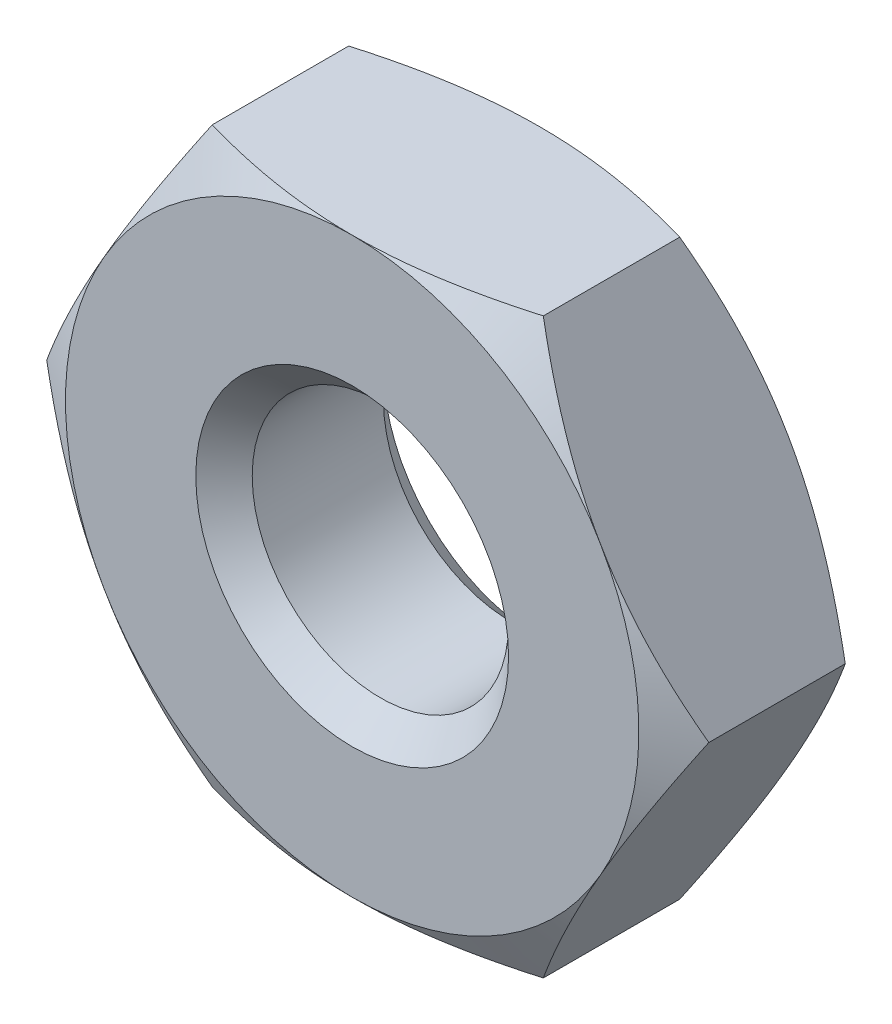
ISO-10303-21;
HEADER;
FILE_DESCRIPTION(('STEP AP214'),'2;1');
FILE_NAME('part.step','',(''),(''),'','','');
FILE_SCHEMA(('AUTOMOTIVE_DESIGN { 1 0 10303 214 1 1 1 1 }'));
ENDSEC;
DATA;
#1=APPLICATION_CONTEXT('core data for automotive mechanical design processes');
#2=APPLICATION_PROTOCOL_DEFINITION('international standard','automotive_design',2000,#1);
#3=PRODUCT_CONTEXT('',#1,'mechanical');
#4=PRODUCT('Part','Part','',(#3));
#5=PRODUCT_RELATED_PRODUCT_CATEGORY('part','',(#4));
#6=PRODUCT_DEFINITION_FORMATION('','',#4);
#7=PRODUCT_DEFINITION_CONTEXT('part definition',#1,'design');
#8=PRODUCT_DEFINITION('design','',#6,#7);
#9=PRODUCT_DEFINITION_SHAPE('','',#8);
#10=(LENGTH_UNIT() NAMED_UNIT(*) SI_UNIT(.MILLI.,.METRE.));
#11=(NAMED_UNIT(*) PLANE_ANGLE_UNIT() SI_UNIT($,.RADIAN.));
#12=(NAMED_UNIT(*) SI_UNIT($,.STERADIAN.) SOLID_ANGLE_UNIT());
#13=UNCERTAINTY_MEASURE_WITH_UNIT(LENGTH_MEASURE(1.E-05),#10,'distance_accuracy_value','');
#14=(GEOMETRIC_REPRESENTATION_CONTEXT(3) GLOBAL_UNCERTAINTY_ASSIGNED_CONTEXT((#13)) GLOBAL_UNIT_ASSIGNED_CONTEXT((#10,
#11,#12)) REPRESENTATION_CONTEXT('',''));
#15=CARTESIAN_POINT('',(0.,0.,0.));
#16=DIRECTION('',(0.,0.,1.));
#17=DIRECTION('',(1.,0.,0.));
#18=AXIS2_PLACEMENT_3D('',#15,#16,#17);
#19=CARTESIAN_POINT('',(2.38156986040721,1.375,-1.));
#20=DIRECTION('',(0.866025403784439,0.5,0.));
#21=DIRECTION('',(-0.5,0.866025403784439,0.));
#22=AXIS2_PLACEMENT_3D('',#19,#20,#21);
#23=PLANE('',#22);
#24=CARTESIAN_POINT('',(1.58689004084149,2.75142582323749,0.246095552242078));
#25=CARTESIAN_POINT('',(2.01280892325374,2.01371267899652,0.));
#26=CARTESIAN_POINT('',(2.38156986040721,1.375,0.));
#27=CARTESIAN_POINT('',(2.75033079756067,0.736287321003483,0.));
#28=CARTESIAN_POINT('',(3.17624967997292,-0.00142582323749121,0.246095552242078));
#29=(BOUNDED_CURVE() B_SPLINE_CURVE(2,(#24,#25,#26,#27,#28),.UNSPECIFIED.,.F.,
.F.) B_SPLINE_CURVE_WITH_KNOTS((3,2,3),(0.,1.6124120093164,3.22482401863281),
.UNSPECIFIED.) CURVE() GEOMETRIC_REPRESENTATION_ITEM() RATIONAL_B_SPLINE_CURVE((1.,
1.03802697460133,1.,1.03802697460133,1.)) REPRESENTATION_ITEM(''));
#30=CARTESIAN_POINT('',(1.58771324027147,2.75,0.245620093061862));
#31=VERTEX_POINT('',#30);
#32=CARTESIAN_POINT('',(2.38156986040721,1.375,0.));
#33=VERTEX_POINT('',#32);
#34=EDGE_CURVE('E229',#31,#33,#29,.T.);
#35=ORIENTED_EDGE('',*,*,#34,.F.);
#36=DIRECTION('',(0.,0.,1.));
#37=VECTOR('',#36,1.);
#38=CARTESIAN_POINT('',(1.58771324027147,2.75,-1.));
#39=LINE('',#38,#37);
#40=CARTESIAN_POINT('',(1.58771324027147,2.75,1.55437990693814));
#41=VERTEX_POINT('',#40);
#42=EDGE_CURVE('E11',#31,#41,#39,.T.);
#43=ORIENTED_EDGE('',*,*,#42,.T.);
#44=CARTESIAN_POINT('',(3.17624967997292,-0.00142582323749113,1.55390444775792));
#45=CARTESIAN_POINT('',(2.75033079756067,0.736287321003483,1.8));
#46=CARTESIAN_POINT('',(2.38156986040721,1.375,1.8));
#47=CARTESIAN_POINT('',(2.01280892325374,2.01371267899652,1.8));
#48=CARTESIAN_POINT('',(1.58689004084149,2.75142582323749,1.55390444775792));
#49=(BOUNDED_CURVE() B_SPLINE_CURVE(2,(#44,#45,#46,#47,#48),.UNSPECIFIED.,.F.,
.F.) B_SPLINE_CURVE_WITH_KNOTS((3,2,3),(0.,1.6124120093164,3.22482401863281),
.UNSPECIFIED.) CURVE() GEOMETRIC_REPRESENTATION_ITEM() RATIONAL_B_SPLINE_CURVE((1.,
1.03802697460133,1.,1.03802697460132,1.)) REPRESENTATION_ITEM(''));
#50=CARTESIAN_POINT('',(2.38156986040721,1.375,1.8));
#51=VERTEX_POINT('',#50);
#52=EDGE_CURVE('E221',#51,#41,#49,.T.);
#53=ORIENTED_EDGE('',*,*,#52,.F.);
#54=CARTESIAN_POINT('',(3.17624967997292,-0.00142582323749113,1.55390444775792));
#55=CARTESIAN_POINT('',(2.75033079756067,0.736287321003483,1.8));
#56=CARTESIAN_POINT('',(2.38156986040721,1.375,1.8));
#57=CARTESIAN_POINT('',(2.01280892325374,2.01371267899652,1.8));
#58=CARTESIAN_POINT('',(1.58689004084149,2.75142582323749,1.55390444775792));
#59=(BOUNDED_CURVE() B_SPLINE_CURVE(2,(#54,#55,#56,#57,#58),.UNSPECIFIED.,.F.,
.F.) B_SPLINE_CURVE_WITH_KNOTS((3,2,3),(0.,1.6124120093164,3.22482401863281),
.UNSPECIFIED.) CURVE() GEOMETRIC_REPRESENTATION_ITEM() RATIONAL_B_SPLINE_CURVE((1.,
1.03802697460133,1.,1.03802697460132,1.)) REPRESENTATION_ITEM(''));
#60=CARTESIAN_POINT('',(3.17542648054294,0.,1.55437990693814));
#61=VERTEX_POINT('',#60);
#62=EDGE_CURVE('E222',#61,#51,#59,.T.);
#63=ORIENTED_EDGE('',*,*,#62,.F.);
#64=DIRECTION('',(0.,0.,1.));
#65=VECTOR('',#64,1.);
#66=CARTESIAN_POINT('',(3.17542648054294,0.,-1.));
#67=LINE('',#66,#65);
#68=CARTESIAN_POINT('',(3.17542648054294,0.,0.245620093061863));
#69=VERTEX_POINT('',#68);
#70=EDGE_CURVE('E179',#69,#61,#67,.T.);
#71=ORIENTED_EDGE('',*,*,#70,.F.);
#72=CARTESIAN_POINT('',(1.58689004084149,2.75142582323749,0.246095552242078));
#73=CARTESIAN_POINT('',(2.01280892325374,2.01371267899652,0.));
#74=CARTESIAN_POINT('',(2.38156986040721,1.375,0.));
#75=CARTESIAN_POINT('',(2.75033079756067,0.736287321003483,0.));
#76=CARTESIAN_POINT('',(3.17624967997292,-0.00142582323749121,0.246095552242078));
#77=(BOUNDED_CURVE() B_SPLINE_CURVE(2,(#72,#73,#74,#75,#76),.UNSPECIFIED.,.F.,
.F.) B_SPLINE_CURVE_WITH_KNOTS((3,2,3),(0.,1.6124120093164,3.22482401863281),
.UNSPECIFIED.) CURVE() GEOMETRIC_REPRESENTATION_ITEM() RATIONAL_B_SPLINE_CURVE((1.,
1.03802697460133,1.,1.03802697460133,1.)) REPRESENTATION_ITEM(''));
#78=EDGE_CURVE('E209',#33,#69,#77,.T.);
#79=ORIENTED_EDGE('',*,*,#78,.F.);
#80=EDGE_LOOP('',(#35,#43,#53,#63,#71,#79));
#81=FACE_BOUND('',#80,.T.);
#82=ADVANCED_FACE('F16',(#81),#23,.T.);
#83=CARTESIAN_POINT('',(0.,2.75,-1.));
#84=DIRECTION('',(0.,1.,0.));
#85=DIRECTION('',(-1.,0.,0.));
#86=AXIS2_PLACEMENT_3D('',#83,#84,#85);
#87=PLANE('',#86);
#88=CARTESIAN_POINT('',(-1.58935963913144,2.75,0.246095552242078));
#89=CARTESIAN_POINT('',(-0.737521874306931,2.75,0.));
#90=CARTESIAN_POINT('',(0.,2.75,0.));
#91=CARTESIAN_POINT('',(0.737521874306931,2.75,0.));
#92=CARTESIAN_POINT('',(1.58935963913144,2.75,0.246095552242078));
#93=(BOUNDED_CURVE() B_SPLINE_CURVE(2,(#88,#89,#90,#91,#92),.UNSPECIFIED.,.F.,
.F.) B_SPLINE_CURVE_WITH_KNOTS((3,2,3),(0.,1.6124120093164,3.22482401863281),
.UNSPECIFIED.) CURVE() GEOMETRIC_REPRESENTATION_ITEM() RATIONAL_B_SPLINE_CURVE((1.,
1.03802697460135,1.,1.03802697460135,1.)) REPRESENTATION_ITEM(''));
#94=CARTESIAN_POINT('',(-1.58771324027147,2.75,0.245620093061861));
#95=VERTEX_POINT('',#94);
#96=CARTESIAN_POINT('',(0.,2.75,0.));
#97=VERTEX_POINT('',#96);
#98=EDGE_CURVE('E165',#95,#97,#93,.T.);
#99=ORIENTED_EDGE('',*,*,#98,.F.);
#100=DIRECTION('',(0.,0.,1.));
#101=VECTOR('',#100,1.);
#102=CARTESIAN_POINT('',(-1.58771324027147,2.75,-1.));
#103=LINE('',#102,#101);
#104=CARTESIAN_POINT('',(-1.58771324027147,2.75,1.55437990693814));
#105=VERTEX_POINT('',#104);
#106=EDGE_CURVE('E28',#95,#105,#103,.T.);
#107=ORIENTED_EDGE('',*,*,#106,.T.);
#108=CARTESIAN_POINT('',(1.58935963913144,2.75,1.55390444775792));
#109=CARTESIAN_POINT('',(0.737521874306932,2.74999999999999,1.8));
#110=CARTESIAN_POINT('',(0.,2.75,1.8));
#111=CARTESIAN_POINT('',(-0.737521874306932,2.74999999999999,1.8));
#112=CARTESIAN_POINT('',(-1.58935963913144,2.75,1.55390444775792));
#113=(BOUNDED_CURVE() B_SPLINE_CURVE(2,(#108,#109,#110,#111,#112),.UNSPECIFIED.,.F.,
.F.) B_SPLINE_CURVE_WITH_KNOTS((3,2,3),(0.,1.6124120093164,3.22482401863281),
.UNSPECIFIED.) CURVE() GEOMETRIC_REPRESENTATION_ITEM() RATIONAL_B_SPLINE_CURVE((1.,
1.03802697460134,1.,1.03802697460134,1.)) REPRESENTATION_ITEM(''));
#114=CARTESIAN_POINT('',(0.,2.75,1.8));
#115=VERTEX_POINT('',#114);
#116=EDGE_CURVE('E145',#115,#105,#113,.T.);
#117=ORIENTED_EDGE('',*,*,#116,.F.);
#118=CARTESIAN_POINT('',(1.58935963913144,2.75,1.55390444775792));
#119=CARTESIAN_POINT('',(0.737521874306932,2.74999999999999,1.8));
#120=CARTESIAN_POINT('',(0.,2.75,1.8));
#121=CARTESIAN_POINT('',(-0.737521874306932,2.74999999999999,1.8));
#122=CARTESIAN_POINT('',(-1.58935963913144,2.75,1.55390444775792));
#123=(BOUNDED_CURVE() B_SPLINE_CURVE(2,(#118,#119,#120,#121,#122),.UNSPECIFIED.,.F.,
.F.) B_SPLINE_CURVE_WITH_KNOTS((3,2,3),(0.,1.6124120093164,3.22482401863281),
.UNSPECIFIED.) CURVE() GEOMETRIC_REPRESENTATION_ITEM() RATIONAL_B_SPLINE_CURVE((1.,
1.03802697460134,1.,1.03802697460134,1.)) REPRESENTATION_ITEM(''));
#124=EDGE_CURVE('E260',#41,#115,#123,.T.);
#125=ORIENTED_EDGE('',*,*,#124,.F.);
#126=ORIENTED_EDGE('',*,*,#42,.F.);
#127=CARTESIAN_POINT('',(-1.58935963913144,2.75,0.246095552242078));
#128=CARTESIAN_POINT('',(-0.737521874306931,2.75,0.));
#129=CARTESIAN_POINT('',(0.,2.75,0.));
#130=CARTESIAN_POINT('',(0.737521874306931,2.75,0.));
#131=CARTESIAN_POINT('',(1.58935963913144,2.75,0.246095552242078));
#132=(BOUNDED_CURVE() B_SPLINE_CURVE(2,(#127,#128,#129,#130,#131),.UNSPECIFIED.,.F.,
.F.) B_SPLINE_CURVE_WITH_KNOTS((3,2,3),(0.,1.6124120093164,3.22482401863281),
.UNSPECIFIED.) CURVE() GEOMETRIC_REPRESENTATION_ITEM() RATIONAL_B_SPLINE_CURVE((1.,
1.03802697460135,1.,1.03802697460135,1.)) REPRESENTATION_ITEM(''));
#133=EDGE_CURVE('E208',#97,#31,#132,.T.);
#134=ORIENTED_EDGE('',*,*,#133,.F.);
#135=EDGE_LOOP('',(#99,#107,#117,#125,#126,#134));
#136=FACE_BOUND('',#135,.T.);
#137=ADVANCED_FACE('F398',(#136),#87,.T.);
#138=CARTESIAN_POINT('',(-2.38156986040721,1.375,-1.));
#139=DIRECTION('',(-0.866025403784439,0.5,0.));
#140=DIRECTION('',(-0.5,-0.866025403784439,0.));
#141=AXIS2_PLACEMENT_3D('',#138,#139,#140);
#142=PLANE('',#141);
#143=CARTESIAN_POINT('',(-3.17624967997292,-0.00142582323748954,0.246095552242078));
#144=CARTESIAN_POINT('',(-2.75033079756068,0.736287321003483,0.));
#145=CARTESIAN_POINT('',(-2.38156986040721,1.375,0.));
#146=CARTESIAN_POINT('',(-2.01280892325374,2.01371267899652,0.));
#147=CARTESIAN_POINT('',(-1.58689004084149,2.75142582323749,0.246095552242078));
#148=(BOUNDED_CURVE() B_SPLINE_CURVE(2,(#143,#144,#145,#146,#147),.UNSPECIFIED.,.F.,
.F.) B_SPLINE_CURVE_WITH_KNOTS((3,2,3),(0.,1.6124120093164,3.22482401863281),
.UNSPECIFIED.) CURVE() GEOMETRIC_REPRESENTATION_ITEM() RATIONAL_B_SPLINE_CURVE((1.,
1.03802697460134,1.,1.03802697460135,1.)) REPRESENTATION_ITEM(''));
#149=CARTESIAN_POINT('',(-3.17542648054294,0.,0.245620093061863));
#150=VERTEX_POINT('',#149);
#151=CARTESIAN_POINT('',(-2.38156986040721,1.375,0.));
#152=VERTEX_POINT('',#151);
#153=EDGE_CURVE('E126',#150,#152,#148,.T.);
#154=ORIENTED_EDGE('',*,*,#153,.F.);
#155=DIRECTION('',(0.,0.,1.));
#156=VECTOR('',#155,1.);
#157=CARTESIAN_POINT('',(-3.17542648054294,0.,-1.));
#158=LINE('',#157,#156);
#159=CARTESIAN_POINT('',(-3.17542648054294,0.,1.55437990693814));
#160=VERTEX_POINT('',#159);
#161=EDGE_CURVE('E118',#150,#160,#158,.T.);
#162=ORIENTED_EDGE('',*,*,#161,.T.);
#163=CARTESIAN_POINT('',(-1.58689004084148,2.75142582323749,1.55390444775792));
#164=CARTESIAN_POINT('',(-2.01280892325374,2.01371267899652,1.8));
#165=CARTESIAN_POINT('',(-2.38156986040721,1.375,1.8));
#166=CARTESIAN_POINT('',(-2.75033079756067,0.736287321003481,1.8));
#167=CARTESIAN_POINT('',(-3.17624967997292,-0.00142582323749089,1.55390444775792));
#168=(BOUNDED_CURVE() B_SPLINE_CURVE(2,(#163,#164,#165,#166,#167),.UNSPECIFIED.,.F.,
.F.) B_SPLINE_CURVE_WITH_KNOTS((3,2,3),(0.,1.6124120093164,3.22482401863281),
.UNSPECIFIED.) CURVE() GEOMETRIC_REPRESENTATION_ITEM() RATIONAL_B_SPLINE_CURVE((1.,
1.03802697460136,1.,1.03802697460135,1.)) REPRESENTATION_ITEM(''));
#169=CARTESIAN_POINT('',(-2.38156986040721,1.375,1.8));
#170=VERTEX_POINT('',#169);
#171=EDGE_CURVE('E122',#170,#160,#168,.T.);
#172=ORIENTED_EDGE('',*,*,#171,.F.);
#173=CARTESIAN_POINT('',(-1.58689004084148,2.75142582323749,1.55390444775792));
#174=CARTESIAN_POINT('',(-2.01280892325374,2.01371267899652,1.8));
#175=CARTESIAN_POINT('',(-2.38156986040721,1.375,1.8));
#176=CARTESIAN_POINT('',(-2.75033079756067,0.736287321003481,1.8));
#177=CARTESIAN_POINT('',(-3.17624967997292,-0.00142582323749089,1.55390444775792));
#178=(BOUNDED_CURVE() B_SPLINE_CURVE(2,(#173,#174,#175,#176,#177),.UNSPECIFIED.,.F.,
.F.) B_SPLINE_CURVE_WITH_KNOTS((3,2,3),(0.,1.6124120093164,3.22482401863281),
.UNSPECIFIED.) CURVE() GEOMETRIC_REPRESENTATION_ITEM() RATIONAL_B_SPLINE_CURVE((1.,
1.03802697460136,1.,1.03802697460135,1.)) REPRESENTATION_ITEM(''));
#179=EDGE_CURVE('E204',#105,#170,#178,.T.);
#180=ORIENTED_EDGE('',*,*,#179,.F.);
#181=ORIENTED_EDGE('',*,*,#106,.F.);
#182=CARTESIAN_POINT('',(-3.17624967997292,-0.00142582323748954,0.246095552242078));
#183=CARTESIAN_POINT('',(-2.75033079756068,0.736287321003483,0.));
#184=CARTESIAN_POINT('',(-2.38156986040721,1.375,0.));
#185=CARTESIAN_POINT('',(-2.01280892325374,2.01371267899652,0.));
#186=CARTESIAN_POINT('',(-1.58689004084149,2.75142582323749,0.246095552242078));
#187=(BOUNDED_CURVE() B_SPLINE_CURVE(2,(#182,#183,#184,#185,#186),.UNSPECIFIED.,.F.,
.F.) B_SPLINE_CURVE_WITH_KNOTS((3,2,3),(0.,1.6124120093164,3.22482401863281),
.UNSPECIFIED.) CURVE() GEOMETRIC_REPRESENTATION_ITEM() RATIONAL_B_SPLINE_CURVE((1.,
1.03802697460134,1.,1.03802697460135,1.)) REPRESENTATION_ITEM(''));
#188=EDGE_CURVE('E157',#152,#95,#187,.T.);
#189=ORIENTED_EDGE('',*,*,#188,.F.);
#190=EDGE_LOOP('',(#154,#162,#172,#180,#181,#189));
#191=FACE_BOUND('',#190,.T.);
#192=ADVANCED_FACE('F120',(#191),#142,.T.);
#193=CARTESIAN_POINT('',(2.38156986040721,-1.375,-1.));
#194=DIRECTION('',(0.866025403784439,-0.5,0.));
#195=DIRECTION('',(0.5,0.866025403784439,0.));
#196=AXIS2_PLACEMENT_3D('',#193,#194,#195);
#197=PLANE('',#196);
#198=CARTESIAN_POINT('',(3.17624967997292,0.00142582323749005,0.246095552242078));
#199=CARTESIAN_POINT('',(2.75033079756067,-0.736287321003482,0.));
#200=CARTESIAN_POINT('',(2.38156986040721,-1.375,0.));
#201=CARTESIAN_POINT('',(2.01280892325374,-2.01371267899652,0.));
#202=CARTESIAN_POINT('',(1.58689004084149,-2.75142582323749,0.246095552242078));
#203=(BOUNDED_CURVE() B_SPLINE_CURVE(2,(#198,#199,#200,#201,#202),.UNSPECIFIED.,.F.,
.F.) B_SPLINE_CURVE_WITH_KNOTS((3,2,3),(0.,1.6124120093164,3.22482401863281),
.UNSPECIFIED.) CURVE() GEOMETRIC_REPRESENTATION_ITEM() RATIONAL_B_SPLINE_CURVE((1.,
1.03802697460135,1.,1.03802697460135,1.)) REPRESENTATION_ITEM(''));
#204=CARTESIAN_POINT('',(2.38156986040721,-1.375,0.));
#205=VERTEX_POINT('',#204);
#206=CARTESIAN_POINT('',(1.58771324027147,-2.75,0.245620093061863));
#207=VERTEX_POINT('',#206);
#208=EDGE_CURVE('E239',#205,#207,#203,.T.);
#209=ORIENTED_EDGE('',*,*,#208,.F.);
#210=CARTESIAN_POINT('',(3.17624967997292,0.00142582323749005,0.246095552242078));
#211=CARTESIAN_POINT('',(2.75033079756067,-0.736287321003482,0.));
#212=CARTESIAN_POINT('',(2.38156986040721,-1.375,0.));
#213=CARTESIAN_POINT('',(2.01280892325374,-2.01371267899652,0.));
#214=CARTESIAN_POINT('',(1.58689004084149,-2.75142582323749,0.246095552242078));
#215=(BOUNDED_CURVE() B_SPLINE_CURVE(2,(#210,#211,#212,#213,#214),.UNSPECIFIED.,.F.,
.F.) B_SPLINE_CURVE_WITH_KNOTS((3,2,3),(0.,1.6124120093164,3.22482401863281),
.UNSPECIFIED.) CURVE() GEOMETRIC_REPRESENTATION_ITEM() RATIONAL_B_SPLINE_CURVE((1.,
1.03802697460135,1.,1.03802697460135,1.)) REPRESENTATION_ITEM(''));
#216=EDGE_CURVE('E205',#69,#205,#215,.T.);
#217=ORIENTED_EDGE('',*,*,#216,.F.);
#218=ORIENTED_EDGE('',*,*,#70,.T.);
#219=CARTESIAN_POINT('',(1.58689004084149,-2.75142582323749,1.55390444775792));
#220=CARTESIAN_POINT('',(2.01280892325374,-2.01371267899652,1.8));
#221=CARTESIAN_POINT('',(2.38156986040721,-1.375,1.8));
#222=CARTESIAN_POINT('',(2.75033079756068,-0.736287321003482,1.8));
#223=CARTESIAN_POINT('',(3.17624967997292,0.00142582323749013,1.55390444775792));
#224=(BOUNDED_CURVE() B_SPLINE_CURVE(2,(#219,#220,#221,#222,#223),.UNSPECIFIED.,.F.,
.F.) B_SPLINE_CURVE_WITH_KNOTS((3,2,3),(0.,1.6124120093164,3.22482401863281),
.UNSPECIFIED.) CURVE() GEOMETRIC_REPRESENTATION_ITEM() RATIONAL_B_SPLINE_CURVE((1.,
1.03802697460133,1.,1.03802697460135,1.)) REPRESENTATION_ITEM(''));
#225=CARTESIAN_POINT('',(2.38156986040721,-1.375,1.8));
#226=VERTEX_POINT('',#225);
#227=EDGE_CURVE('E283',#226,#61,#224,.T.);
#228=ORIENTED_EDGE('',*,*,#227,.F.);
#229=CARTESIAN_POINT('',(1.58689004084149,-2.75142582323749,1.55390444775792));
#230=CARTESIAN_POINT('',(2.01280892325374,-2.01371267899652,1.8));
#231=CARTESIAN_POINT('',(2.38156986040721,-1.375,1.8));
#232=CARTESIAN_POINT('',(2.75033079756068,-0.736287321003482,1.8));
#233=CARTESIAN_POINT('',(3.17624967997292,0.00142582323749013,1.55390444775792));
#234=(BOUNDED_CURVE() B_SPLINE_CURVE(2,(#229,#230,#231,#232,#233),.UNSPECIFIED.,.F.,
.F.) B_SPLINE_CURVE_WITH_KNOTS((3,2,3),(0.,1.6124120093164,3.22482401863281),
.UNSPECIFIED.) CURVE() GEOMETRIC_REPRESENTATION_ITEM() RATIONAL_B_SPLINE_CURVE((1.,
1.03802697460133,1.,1.03802697460135,1.)) REPRESENTATION_ITEM(''));
#235=CARTESIAN_POINT('',(1.58771324027147,-2.75,1.55437990693814));
#236=VERTEX_POINT('',#235);
#237=EDGE_CURVE('E185',#236,#226,#234,.T.);
#238=ORIENTED_EDGE('',*,*,#237,.F.);
#239=DIRECTION('',(0.,0.,1.));
#240=VECTOR('',#239,1.);
#241=CARTESIAN_POINT('',(1.58771324027147,-2.75,-1.));
#242=LINE('',#241,#240);
#243=EDGE_CURVE('E130',#207,#236,#242,.T.);
#244=ORIENTED_EDGE('',*,*,#243,.F.);
#245=EDGE_LOOP('',(#209,#217,#218,#228,#238,#244));
#246=FACE_BOUND('',#245,.T.);
#247=ADVANCED_FACE('F375',(#246),#197,.T.);
#248=CARTESIAN_POINT('',(0.,-2.75,-1.));
#249=DIRECTION('',(0.,-1.,0.));
#250=DIRECTION('',(1.,0.,0.));
#251=AXIS2_PLACEMENT_3D('',#248,#249,#250);
#252=PLANE('',#251);
#253=CARTESIAN_POINT('',(1.58935963913144,-2.75,0.246095552242078));
#254=CARTESIAN_POINT('',(0.737521874306931,-2.75,0.));
#255=CARTESIAN_POINT('',(0.,-2.75,0.));
#256=CARTESIAN_POINT('',(-0.737521874306931,-2.75,0.));
#257=CARTESIAN_POINT('',(-1.58935963913144,-2.75,0.246095552242078));
#258=(BOUNDED_CURVE() B_SPLINE_CURVE(2,(#253,#254,#255,#256,#257),.UNSPECIFIED.,.F.,
.F.) B_SPLINE_CURVE_WITH_KNOTS((3,2,3),(0.,1.6124120093164,3.22482401863281),
.UNSPECIFIED.) CURVE() GEOMETRIC_REPRESENTATION_ITEM() RATIONAL_B_SPLINE_CURVE((1.,
1.03802697460134,1.,1.03802697460135,1.)) REPRESENTATION_ITEM(''));
#259=CARTESIAN_POINT('',(0.,-2.75,0.));
#260=VERTEX_POINT('',#259);
#261=CARTESIAN_POINT('',(-1.58771324027147,-2.75,0.245620093061863));
#262=VERTEX_POINT('',#261);
#263=EDGE_CURVE('E269',#260,#262,#258,.T.);
#264=ORIENTED_EDGE('',*,*,#263,.F.);
#265=CARTESIAN_POINT('',(1.58935963913144,-2.75,0.246095552242078));
#266=CARTESIAN_POINT('',(0.737521874306931,-2.75,0.));
#267=CARTESIAN_POINT('',(0.,-2.75,0.));
#268=CARTESIAN_POINT('',(-0.737521874306931,-2.75,0.));
#269=CARTESIAN_POINT('',(-1.58935963913144,-2.75,0.246095552242078));
#270=(BOUNDED_CURVE() B_SPLINE_CURVE(2,(#265,#266,#267,#268,#269),.UNSPECIFIED.,.F.,
.F.) B_SPLINE_CURVE_WITH_KNOTS((3,2,3),(0.,1.6124120093164,3.22482401863281),
.UNSPECIFIED.) CURVE() GEOMETRIC_REPRESENTATION_ITEM() RATIONAL_B_SPLINE_CURVE((1.,
1.03802697460134,1.,1.03802697460135,1.)) REPRESENTATION_ITEM(''));
#271=EDGE_CURVE('E186',#207,#260,#270,.T.);
#272=ORIENTED_EDGE('',*,*,#271,.F.);
#273=ORIENTED_EDGE('',*,*,#243,.T.);
#274=CARTESIAN_POINT('',(-1.58935963913144,-2.75,1.55390444775792));
#275=CARTESIAN_POINT('',(-0.737521874306933,-2.75,1.8));
#276=CARTESIAN_POINT('',(0.,-2.75,1.8));
#277=CARTESIAN_POINT('',(0.737521874306932,-2.74999999999999,1.8));
#278=CARTESIAN_POINT('',(1.58935963913144,-2.75,1.55390444775792));
#279=(BOUNDED_CURVE() B_SPLINE_CURVE(2,(#274,#275,#276,#277,#278),.UNSPECIFIED.,.F.,
.F.) B_SPLINE_CURVE_WITH_KNOTS((3,2,3),(0.,1.6124120093164,3.22482401863281),
.UNSPECIFIED.) CURVE() GEOMETRIC_REPRESENTATION_ITEM() RATIONAL_B_SPLINE_CURVE((1.,
1.03802697460136,1.,1.03802697460134,1.)) REPRESENTATION_ITEM(''));
#280=CARTESIAN_POINT('',(0.,-2.75,1.8));
#281=VERTEX_POINT('',#280);
#282=EDGE_CURVE('E180',#281,#236,#279,.T.);
#283=ORIENTED_EDGE('',*,*,#282,.F.);
#284=CARTESIAN_POINT('',(-1.58935963913144,-2.75,1.55390444775792));
#285=CARTESIAN_POINT('',(-0.737521874306933,-2.75,1.8));
#286=CARTESIAN_POINT('',(0.,-2.75,1.8));
#287=CARTESIAN_POINT('',(0.737521874306932,-2.74999999999999,1.8));
#288=CARTESIAN_POINT('',(1.58935963913144,-2.75,1.55390444775792));
#289=(BOUNDED_CURVE() B_SPLINE_CURVE(2,(#284,#285,#286,#287,#288),.UNSPECIFIED.,.F.,
.F.) B_SPLINE_CURVE_WITH_KNOTS((3,2,3),(0.,1.6124120093164,3.22482401863281),
.UNSPECIFIED.) CURVE() GEOMETRIC_REPRESENTATION_ITEM() RATIONAL_B_SPLINE_CURVE((1.,
1.03802697460136,1.,1.03802697460134,1.)) REPRESENTATION_ITEM(''));
#290=CARTESIAN_POINT('',(-1.58771324027147,-2.75,1.55437990693814));
#291=VERTEX_POINT('',#290);
#292=EDGE_CURVE('E140',#291,#281,#289,.T.);
#293=ORIENTED_EDGE('',*,*,#292,.F.);
#294=DIRECTION('',(0.,0.,1.));
#295=VECTOR('',#294,1.);
#296=CARTESIAN_POINT('',(-1.58771324027147,-2.75,-1.));
#297=LINE('',#296,#295);
#298=EDGE_CURVE('E131',#262,#291,#297,.T.);
#299=ORIENTED_EDGE('',*,*,#298,.F.);
#300=EDGE_LOOP('',(#264,#272,#273,#283,#293,#299));
#301=FACE_BOUND('',#300,.T.);
#302=ADVANCED_FACE('F369',(#301),#252,.T.);
#303=CARTESIAN_POINT('',(-2.38156986040721,-1.375,-1.));
#304=DIRECTION('',(-0.866025403784439,-0.5,0.));
#305=DIRECTION('',(0.5,-0.866025403784439,0.));
#306=AXIS2_PLACEMENT_3D('',#303,#304,#305);
#307=PLANE('',#306);
#308=CARTESIAN_POINT('',(-1.58689004084149,-2.75142582323749,0.246095552242078));
#309=CARTESIAN_POINT('',(-2.01280892325374,-2.01371267899651,0.));
#310=CARTESIAN_POINT('',(-2.38156986040721,-1.375,0.));
#311=CARTESIAN_POINT('',(-2.75033079756067,-0.736287321003481,0.));
#312=CARTESIAN_POINT('',(-3.17624967997292,0.00142582323749124,0.246095552242078));
#313=(BOUNDED_CURVE() B_SPLINE_CURVE(2,(#308,#309,#310,#311,#312),.UNSPECIFIED.,.F.,
.F.) B_SPLINE_CURVE_WITH_KNOTS((3,2,3),(0.,1.6124120093164,3.22482401863281),
.UNSPECIFIED.) CURVE() GEOMETRIC_REPRESENTATION_ITEM() RATIONAL_B_SPLINE_CURVE((1.,
1.03802697460134,1.,1.03802697460133,1.)) REPRESENTATION_ITEM(''));
#314=CARTESIAN_POINT('',(-2.38156986040721,-1.375,0.));
#315=VERTEX_POINT('',#314);
#316=EDGE_CURVE('E166',#315,#150,#313,.T.);
#317=ORIENTED_EDGE('',*,*,#316,.F.);
#318=CARTESIAN_POINT('',(-1.58689004084149,-2.75142582323749,0.246095552242078));
#319=CARTESIAN_POINT('',(-2.01280892325374,-2.01371267899651,0.));
#320=CARTESIAN_POINT('',(-2.38156986040721,-1.375,0.));
#321=CARTESIAN_POINT('',(-2.75033079756067,-0.736287321003481,0.));
#322=CARTESIAN_POINT('',(-3.17624967997292,0.00142582323749124,0.246095552242078));
#323=(BOUNDED_CURVE() B_SPLINE_CURVE(2,(#318,#319,#320,#321,#322),.UNSPECIFIED.,.F.,
.F.) B_SPLINE_CURVE_WITH_KNOTS((3,2,3),(0.,1.6124120093164,3.22482401863281),
.UNSPECIFIED.) CURVE() GEOMETRIC_REPRESENTATION_ITEM() RATIONAL_B_SPLINE_CURVE((1.,
1.03802697460134,1.,1.03802697460133,1.)) REPRESENTATION_ITEM(''));
#324=EDGE_CURVE('E230',#262,#315,#323,.T.);
#325=ORIENTED_EDGE('',*,*,#324,.F.);
#326=ORIENTED_EDGE('',*,*,#298,.T.);
#327=CARTESIAN_POINT('',(-3.17624967997292,0.00142582323749227,1.55390444775792));
#328=CARTESIAN_POINT('',(-2.75033079756068,-0.73628732100348,1.8));
#329=CARTESIAN_POINT('',(-2.38156986040721,-1.375,1.8));
#330=CARTESIAN_POINT('',(-2.01280892325374,-2.01371267899652,1.8));
#331=CARTESIAN_POINT('',(-1.58689004084149,-2.75142582323749,1.55390444775792));
#332=(BOUNDED_CURVE() B_SPLINE_CURVE(2,(#327,#328,#329,#330,#331),.UNSPECIFIED.,.F.,
.F.) B_SPLINE_CURVE_WITH_KNOTS((3,2,3),(0.,1.6124120093164,3.22482401863281),
.UNSPECIFIED.) CURVE() GEOMETRIC_REPRESENTATION_ITEM() RATIONAL_B_SPLINE_CURVE((1.,
1.03802697460134,1.,1.03802697460137,1.)) REPRESENTATION_ITEM(''));
#333=CARTESIAN_POINT('',(-2.38156986040721,-1.375,1.8));
#334=VERTEX_POINT('',#333);
#335=EDGE_CURVE('E20',#334,#291,#332,.T.);
#336=ORIENTED_EDGE('',*,*,#335,.F.);
#337=CARTESIAN_POINT('',(-3.17624967997292,0.00142582323749227,1.55390444775792));
#338=CARTESIAN_POINT('',(-2.75033079756068,-0.73628732100348,1.8));
#339=CARTESIAN_POINT('',(-2.38156986040721,-1.375,1.8));
#340=CARTESIAN_POINT('',(-2.01280892325374,-2.01371267899652,1.8));
#341=CARTESIAN_POINT('',(-1.58689004084149,-2.75142582323749,1.55390444775792));
#342=(BOUNDED_CURVE() B_SPLINE_CURVE(2,(#337,#338,#339,#340,#341),.UNSPECIFIED.,.F.,
.F.) B_SPLINE_CURVE_WITH_KNOTS((3,2,3),(0.,1.6124120093164,3.22482401863281),
.UNSPECIFIED.) CURVE() GEOMETRIC_REPRESENTATION_ITEM() RATIONAL_B_SPLINE_CURVE((1.,
1.03802697460134,1.,1.03802697460137,1.)) REPRESENTATION_ITEM(''));
#343=EDGE_CURVE('E136',#160,#334,#342,.T.);
#344=ORIENTED_EDGE('',*,*,#343,.F.);
#345=ORIENTED_EDGE('',*,*,#161,.F.);
#346=EDGE_LOOP('',(#317,#325,#326,#336,#344,#345));
#347=FACE_BOUND('',#346,.T.);
#348=ADVANCED_FACE('F142',(#347),#307,.T.);
#349=CARTESIAN_POINT('',(2.125,0.,0.));
#350=DIRECTION('',(0.,0.,-1.));
#351=DIRECTION('',(-1.,0.,0.));
#352=AXIS2_PLACEMENT_3D('',#349,#350,#351);
#353=PLANE('',#352);
#354=CARTESIAN_POINT('',(0.,0.,0.));
#355=DIRECTION('',(0.,0.,1.));
#356=DIRECTION('',(1.,0.,0.));
#357=AXIS2_PLACEMENT_3D('',#354,#355,#356);
#358=CIRCLE('',#357,1.5);
#359=CARTESIAN_POINT('',(1.5,0.,0.));
#360=VERTEX_POINT('',#359);
#361=EDGE_CURVE('E34',#360,#360,#358,.T.);
#362=ORIENTED_EDGE('',*,*,#361,.T.);
#363=EDGE_LOOP('',(#362));
#364=FACE_BOUND('',#363,.T.);
#365=CARTESIAN_POINT('',(0.,0.,0.));
#366=DIRECTION('',(0.,0.,1.));
#367=DIRECTION('',(1.,0.,0.));
#368=AXIS2_PLACEMENT_3D('',#365,#366,#367);
#369=CIRCLE('',#368,2.75);
#370=EDGE_CURVE('E202',#205,#33,#369,.T.);
#371=ORIENTED_EDGE('',*,*,#370,.F.);
#372=CARTESIAN_POINT('',(0.,0.,0.));
#373=DIRECTION('',(0.,0.,1.));
#374=DIRECTION('',(1.,0.,0.));
#375=AXIS2_PLACEMENT_3D('',#372,#373,#374);
#376=CIRCLE('',#375,2.75);
#377=EDGE_CURVE('E155',#260,#205,#376,.T.);
#378=ORIENTED_EDGE('',*,*,#377,.F.);
#379=CARTESIAN_POINT('',(0.,0.,0.));
#380=DIRECTION('',(0.,0.,1.));
#381=DIRECTION('',(1.,0.,0.));
#382=AXIS2_PLACEMENT_3D('',#379,#380,#381);
#383=CIRCLE('',#382,2.75);
#384=EDGE_CURVE('E238',#315,#260,#383,.T.);
#385=ORIENTED_EDGE('',*,*,#384,.F.);
#386=CARTESIAN_POINT('',(0.,0.,0.));
#387=DIRECTION('',(0.,0.,1.));
#388=DIRECTION('',(1.,0.,0.));
#389=AXIS2_PLACEMENT_3D('',#386,#387,#388);
#390=CIRCLE('',#389,2.75);
#391=EDGE_CURVE('E268',#152,#315,#390,.T.);
#392=ORIENTED_EDGE('',*,*,#391,.F.);
#393=CARTESIAN_POINT('',(0.,0.,0.));
#394=DIRECTION('',(0.,0.,1.));
#395=DIRECTION('',(1.,0.,0.));
#396=AXIS2_PLACEMENT_3D('',#393,#394,#395);
#397=CIRCLE('',#396,2.75);
#398=EDGE_CURVE('E206',#97,#152,#397,.T.);
#399=ORIENTED_EDGE('',*,*,#398,.F.);
#400=CARTESIAN_POINT('',(0.,0.,0.));
#401=DIRECTION('',(0.,0.,1.));
#402=DIRECTION('',(1.,0.,0.));
#403=AXIS2_PLACEMENT_3D('',#400,#401,#402);
#404=CIRCLE('',#403,2.75);
#405=EDGE_CURVE('E214',#33,#97,#404,.T.);
#406=ORIENTED_EDGE('',*,*,#405,.F.);
#407=EDGE_LOOP('',(#371,#378,#385,#392,#399,#406));
#408=FACE_BOUND('',#407,.T.);
#409=ADVANCED_FACE('F363',(#364,#408),#353,.T.);
#410=CARTESIAN_POINT('',(0.,0.,0.1353125));
#411=DIRECTION('',(0.,0.,-1.));
#412=DIRECTION('',(1.,0.,0.));
#413=AXIS2_PLACEMENT_3D('',#410,#411,#412);
#414=CONICAL_SURFACE('',#413,1.3646875,0.785398163397448);
#415=CARTESIAN_POINT('',(0.,0.,0.270625));
#416=DIRECTION('',(0.,0.,1.));
#417=DIRECTION('',(1.,0.,0.));
#418=AXIS2_PLACEMENT_3D('',#415,#416,#417);
#419=CIRCLE('',#418,1.229375);
#420=CARTESIAN_POINT('',(1.229375,0.,0.270625));
#421=VERTEX_POINT('',#420);
#422=EDGE_CURVE('E224',#421,#421,#419,.T.);
#423=ORIENTED_EDGE('',*,*,#422,.T.);
#424=EDGE_LOOP('',(#423));
#425=FACE_BOUND('',#424,.T.);
#426=ORIENTED_EDGE('',*,*,#361,.F.);
#427=EDGE_LOOP('',(#426));
#428=FACE_BOUND('',#427,.T.);
#429=ADVANCED_FACE('F411',(#425,#428),#414,.F.);
#430=CARTESIAN_POINT('',(0.,0.,0.9));
#431=DIRECTION('',(0.,0.,-1.));
#432=DIRECTION('',(1.,0.,0.));
#433=AXIS2_PLACEMENT_3D('',#430,#431,#432);
#434=CYLINDRICAL_SURFACE('',#433,1.229375);
#435=CARTESIAN_POINT('',(0.,0.,1.529375));
#436=DIRECTION('',(0.,0.,1.));
#437=DIRECTION('',(1.,0.,0.));
#438=AXIS2_PLACEMENT_3D('',#435,#436,#437);
#439=CIRCLE('',#438,1.229375);
#440=CARTESIAN_POINT('',(1.229375,0.,1.529375));
#441=VERTEX_POINT('',#440);
#442=EDGE_CURVE('E84',#441,#441,#439,.T.);
#443=ORIENTED_EDGE('',*,*,#442,.T.);
#444=EDGE_LOOP('',(#443));
#445=FACE_BOUND('',#444,.T.);
#446=ORIENTED_EDGE('',*,*,#422,.F.);
#447=EDGE_LOOP('',(#446));
#448=FACE_BOUND('',#447,.T.);
#449=ADVANCED_FACE('F18',(#445,#448),#434,.F.);
#450=CARTESIAN_POINT('',(0.,0.,1.6646875));
#451=DIRECTION('',(0.,0.,1.));
#452=DIRECTION('',(1.,0.,0.));
#453=AXIS2_PLACEMENT_3D('',#450,#451,#452);
#454=CONICAL_SURFACE('',#453,1.3646875,0.785398163397448);
#455=CARTESIAN_POINT('',(0.,0.,1.8));
#456=DIRECTION('',(0.,0.,1.));
#457=DIRECTION('',(1.,0.,0.));
#458=AXIS2_PLACEMENT_3D('',#455,#456,#457);
#459=CIRCLE('',#458,1.5);
#460=CARTESIAN_POINT('',(1.5,0.,1.8));
#461=VERTEX_POINT('',#460);
#462=EDGE_CURVE('E88',#461,#461,#459,.T.);
#463=ORIENTED_EDGE('',*,*,#462,.T.);
#464=EDGE_LOOP('',(#463));
#465=FACE_BOUND('',#464,.T.);
#466=ORIENTED_EDGE('',*,*,#442,.F.);
#467=EDGE_LOOP('',(#466));
#468=FACE_BOUND('',#467,.T.);
#469=ADVANCED_FACE('F417',(#465,#468),#454,.F.);
#470=CARTESIAN_POINT('',(2.125,0.,1.8));
#471=DIRECTION('',(0.,0.,1.));
#472=DIRECTION('',(1.,0.,0.));
#473=AXIS2_PLACEMENT_3D('',#470,#471,#472);
#474=PLANE('',#473);
#475=CARTESIAN_POINT('',(0.,0.,1.8));
#476=DIRECTION('',(0.,0.,1.));
#477=DIRECTION('',(1.,0.,0.));
#478=AXIS2_PLACEMENT_3D('',#475,#476,#477);
#479=CIRCLE('',#478,2.75);
#480=EDGE_CURVE('E215',#226,#51,#479,.T.);
#481=ORIENTED_EDGE('',*,*,#480,.T.);
#482=CARTESIAN_POINT('',(0.,0.,1.8));
#483=DIRECTION('',(0.,0.,1.));
#484=DIRECTION('',(1.,0.,0.));
#485=AXIS2_PLACEMENT_3D('',#482,#483,#484);
#486=CIRCLE('',#485,2.75);
#487=EDGE_CURVE('E313',#51,#115,#486,.T.);
#488=ORIENTED_EDGE('',*,*,#487,.T.);
#489=CARTESIAN_POINT('',(0.,0.,1.8));
#490=DIRECTION('',(0.,0.,1.));
#491=DIRECTION('',(1.,0.,0.));
#492=AXIS2_PLACEMENT_3D('',#489,#490,#491);
#493=CIRCLE('',#492,2.75);
#494=EDGE_CURVE('E149',#115,#170,#493,.T.);
#495=ORIENTED_EDGE('',*,*,#494,.T.);
#496=CARTESIAN_POINT('',(0.,0.,1.8));
#497=DIRECTION('',(0.,0.,1.));
#498=DIRECTION('',(1.,0.,0.));
#499=AXIS2_PLACEMENT_3D('',#496,#497,#498);
#500=CIRCLE('',#499,2.75);
#501=EDGE_CURVE('E138',#170,#334,#500,.T.);
#502=ORIENTED_EDGE('',*,*,#501,.T.);
#503=CARTESIAN_POINT('',(0.,0.,1.8));
#504=DIRECTION('',(0.,0.,1.));
#505=DIRECTION('',(1.,0.,0.));
#506=AXIS2_PLACEMENT_3D('',#503,#504,#505);
#507=CIRCLE('',#506,2.75);
#508=EDGE_CURVE('E174',#334,#281,#507,.T.);
#509=ORIENTED_EDGE('',*,*,#508,.T.);
#510=CARTESIAN_POINT('',(0.,0.,1.8));
#511=DIRECTION('',(0.,0.,1.));
#512=DIRECTION('',(1.,0.,0.));
#513=AXIS2_PLACEMENT_3D('',#510,#511,#512);
#514=CIRCLE('',#513,2.75);
#515=EDGE_CURVE('E288',#281,#226,#514,.T.);
#516=ORIENTED_EDGE('',*,*,#515,.T.);
#517=EDGE_LOOP('',(#481,#488,#495,#502,#509,#516));
#518=FACE_BOUND('',#517,.T.);
#519=ORIENTED_EDGE('',*,*,#462,.F.);
#520=EDGE_LOOP('',(#519));
#521=FACE_BOUND('',#520,.T.);
#522=ADVANCED_FACE('F380',(#518,#521),#474,.T.);
#523=CARTESIAN_POINT('',(0.,0.,1.67695222387896));
#524=DIRECTION('',(0.,0.,-1.));
#525=DIRECTION('',(1.,0.,0.));
#526=AXIS2_PLACEMENT_3D('',#523,#524,#525);
#527=CONICAL_SURFACE('',#526,2.963125,1.0471975511966);
#528=ORIENTED_EDGE('',*,*,#52,.T.);
#529=ORIENTED_EDGE('',*,*,#124,.T.);
#530=ORIENTED_EDGE('',*,*,#487,.F.);
#531=EDGE_LOOP('',(#528,#529,#530));
#532=FACE_BOUND('',#531,.T.);
#533=ADVANCED_FACE('F423',(#532),#527,.T.);
#534=CARTESIAN_POINT('',(0.,0.,1.67695222387896));
#535=DIRECTION('',(0.,0.,-1.));
#536=DIRECTION('',(1.,0.,0.));
#537=AXIS2_PLACEMENT_3D('',#534,#535,#536);
#538=CONICAL_SURFACE('',#537,2.963125,1.0471975511966);
#539=ORIENTED_EDGE('',*,*,#227,.T.);
#540=ORIENTED_EDGE('',*,*,#62,.T.);
#541=ORIENTED_EDGE('',*,*,#480,.F.);
#542=EDGE_LOOP('',(#539,#540,#541));
#543=FACE_BOUND('',#542,.T.);
#544=ADVANCED_FACE('F393',(#543),#538,.T.);
#545=CARTESIAN_POINT('',(0.,0.,1.67695222387896));
#546=DIRECTION('',(0.,0.,-1.));
#547=DIRECTION('',(1.,0.,0.));
#548=AXIS2_PLACEMENT_3D('',#545,#546,#547);
#549=CONICAL_SURFACE('',#548,2.963125,1.0471975511966);
#550=ORIENTED_EDGE('',*,*,#282,.T.);
#551=ORIENTED_EDGE('',*,*,#237,.T.);
#552=ORIENTED_EDGE('',*,*,#515,.F.);
#553=EDGE_LOOP('',(#550,#551,#552));
#554=FACE_BOUND('',#553,.T.);
#555=ADVANCED_FACE('F378',(#554),#549,.T.);
#556=CARTESIAN_POINT('',(0.,0.,1.67695222387896));
#557=DIRECTION('',(0.,0.,-1.));
#558=DIRECTION('',(1.,0.,0.));
#559=AXIS2_PLACEMENT_3D('',#556,#557,#558);
#560=CONICAL_SURFACE('',#559,2.963125,1.0471975511966);
#561=ORIENTED_EDGE('',*,*,#292,.T.);
#562=ORIENTED_EDGE('',*,*,#508,.F.);
#563=ORIENTED_EDGE('',*,*,#335,.T.);
#564=EDGE_LOOP('',(#561,#562,#563));
#565=FACE_BOUND('',#564,.T.);
#566=ADVANCED_FACE('F383',(#565),#560,.T.);
#567=CARTESIAN_POINT('',(0.,0.,1.67695222387896));
#568=DIRECTION('',(0.,0.,-1.));
#569=DIRECTION('',(1.,0.,0.));
#570=AXIS2_PLACEMENT_3D('',#567,#568,#569);
#571=CONICAL_SURFACE('',#570,2.963125,1.0471975511966);
#572=ORIENTED_EDGE('',*,*,#343,.T.);
#573=ORIENTED_EDGE('',*,*,#501,.F.);
#574=ORIENTED_EDGE('',*,*,#171,.T.);
#575=EDGE_LOOP('',(#572,#573,#574));
#576=FACE_BOUND('',#575,.T.);
#577=ADVANCED_FACE('F135',(#576),#571,.T.);
#578=CARTESIAN_POINT('',(0.,0.,1.67695222387896));
#579=DIRECTION('',(0.,0.,-1.));
#580=DIRECTION('',(1.,0.,0.));
#581=AXIS2_PLACEMENT_3D('',#578,#579,#580);
#582=CONICAL_SURFACE('',#581,2.963125,1.0471975511966);
#583=ORIENTED_EDGE('',*,*,#179,.T.);
#584=ORIENTED_EDGE('',*,*,#494,.F.);
#585=ORIENTED_EDGE('',*,*,#116,.T.);
#586=EDGE_LOOP('',(#583,#584,#585));
#587=FACE_BOUND('',#586,.T.);
#588=ADVANCED_FACE('F391',(#587),#582,.T.);
#589=CARTESIAN_POINT('',(0.,0.,0.123047776121039));
#590=DIRECTION('',(0.,0.,1.));
#591=DIRECTION('',(1.,0.,0.));
#592=AXIS2_PLACEMENT_3D('',#589,#590,#591);
#593=CONICAL_SURFACE('',#592,2.963125,1.0471975511966);
#594=ORIENTED_EDGE('',*,*,#78,.T.);
#595=ORIENTED_EDGE('',*,*,#216,.T.);
#596=ORIENTED_EDGE('',*,*,#370,.T.);
#597=EDGE_LOOP('',(#594,#595,#596));
#598=FACE_BOUND('',#597,.T.);
#599=ADVANCED_FACE('F440',(#598),#593,.T.);
#600=CARTESIAN_POINT('',(0.,0.,0.123047776121039));
#601=DIRECTION('',(0.,0.,1.));
#602=DIRECTION('',(1.,0.,0.));
#603=AXIS2_PLACEMENT_3D('',#600,#601,#602);
#604=CONICAL_SURFACE('',#603,2.963125,1.0471975511966);
#605=ORIENTED_EDGE('',*,*,#133,.T.);
#606=ORIENTED_EDGE('',*,*,#34,.T.);
#607=ORIENTED_EDGE('',*,*,#405,.T.);
#608=EDGE_LOOP('',(#605,#606,#607));
#609=FACE_BOUND('',#608,.T.);
#610=ADVANCED_FACE('F445',(#609),#604,.T.);
#611=CARTESIAN_POINT('',(0.,0.,0.123047776121039));
#612=DIRECTION('',(0.,0.,1.));
#613=DIRECTION('',(1.,0.,0.));
#614=AXIS2_PLACEMENT_3D('',#611,#612,#613);
#615=CONICAL_SURFACE('',#614,2.963125,1.0471975511966);
#616=ORIENTED_EDGE('',*,*,#188,.T.);
#617=ORIENTED_EDGE('',*,*,#98,.T.);
#618=ORIENTED_EDGE('',*,*,#398,.T.);
#619=EDGE_LOOP('',(#616,#617,#618));
#620=FACE_BOUND('',#619,.T.);
#621=ADVANCED_FACE('F416',(#620),#615,.T.);
#622=CARTESIAN_POINT('',(0.,0.,0.123047776121039));
#623=DIRECTION('',(0.,0.,1.));
#624=DIRECTION('',(1.,0.,0.));
#625=AXIS2_PLACEMENT_3D('',#622,#623,#624);
#626=CONICAL_SURFACE('',#625,2.963125,1.0471975511966);
#627=ORIENTED_EDGE('',*,*,#153,.T.);
#628=ORIENTED_EDGE('',*,*,#391,.T.);
#629=ORIENTED_EDGE('',*,*,#316,.T.);
#630=EDGE_LOOP('',(#627,#628,#629));
#631=FACE_BOUND('',#630,.T.);
#632=ADVANCED_FACE('F360',(#631),#626,.T.);
#633=CARTESIAN_POINT('',(0.,0.,0.123047776121039));
#634=DIRECTION('',(0.,0.,1.));
#635=DIRECTION('',(1.,0.,0.));
#636=AXIS2_PLACEMENT_3D('',#633,#634,#635);
#637=CONICAL_SURFACE('',#636,2.963125,1.0471975511966);
#638=ORIENTED_EDGE('',*,*,#324,.T.);
#639=ORIENTED_EDGE('',*,*,#384,.T.);
#640=ORIENTED_EDGE('',*,*,#263,.T.);
#641=EDGE_LOOP('',(#638,#639,#640));
#642=FACE_BOUND('',#641,.T.);
#643=ADVANCED_FACE('F353',(#642),#637,.T.);
#644=CARTESIAN_POINT('',(0.,0.,0.123047776121039));
#645=DIRECTION('',(0.,0.,1.));
#646=DIRECTION('',(1.,0.,0.));
#647=AXIS2_PLACEMENT_3D('',#644,#645,#646);
#648=CONICAL_SURFACE('',#647,2.963125,1.0471975511966);
#649=ORIENTED_EDGE('',*,*,#271,.T.);
#650=ORIENTED_EDGE('',*,*,#377,.T.);
#651=ORIENTED_EDGE('',*,*,#208,.T.);
#652=EDGE_LOOP('',(#649,#650,#651));
#653=FACE_BOUND('',#652,.T.);
#654=ADVANCED_FACE('F367',(#653),#648,.T.);
#655=CLOSED_SHELL('',(#82,#137,#192,#247,#302,#348,#409,#429,#449,#469,#522,#533,#544,#555,#566,
#577,#588,#599,#610,#621,#632,#643,#654));
#656=MANIFOLD_SOLID_BREP('B1',#655);
#657=ADVANCED_BREP_SHAPE_REPRESENTATION('',(#18,#656),#14);
#658=SHAPE_DEFINITION_REPRESENTATION(#9,#657);
ENDSEC;
END-ISO-10303-21;
